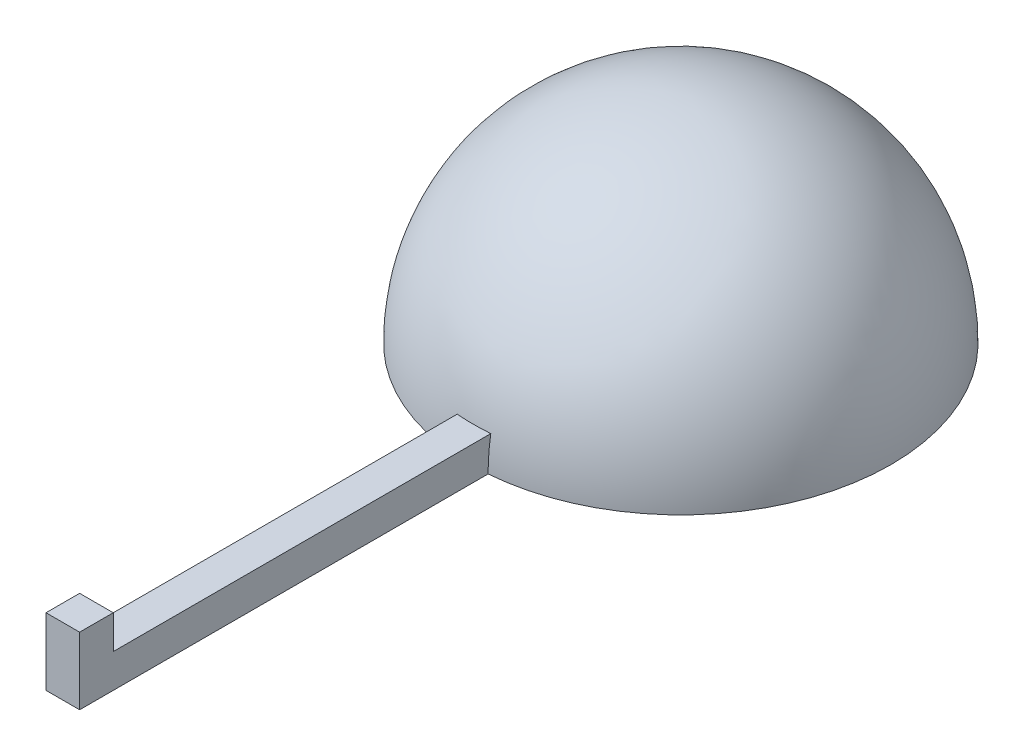
ISO-10303-21;
HEADER;
FILE_DESCRIPTION(('STEP AP214'),'2;1');
FILE_NAME('part.step','',(''),(''),'','','');
FILE_SCHEMA(('AUTOMOTIVE_DESIGN { 1 0 10303 214 1 1 1 1 }'));
ENDSEC;
DATA;
#1=APPLICATION_CONTEXT('core data for automotive mechanical design processes');
#2=APPLICATION_PROTOCOL_DEFINITION('international standard','automotive_design',2000,#1);
#3=PRODUCT_CONTEXT('',#1,'mechanical');
#4=PRODUCT('Part','Part','',(#3));
#5=PRODUCT_RELATED_PRODUCT_CATEGORY('part','',(#4));
#6=PRODUCT_DEFINITION_FORMATION('','',#4);
#7=PRODUCT_DEFINITION_CONTEXT('part definition',#1,'design');
#8=PRODUCT_DEFINITION('design','',#6,#7);
#9=PRODUCT_DEFINITION_SHAPE('','',#8);
#10=(LENGTH_UNIT() NAMED_UNIT(*) SI_UNIT(.MILLI.,.METRE.));
#11=(NAMED_UNIT(*) PLANE_ANGLE_UNIT() SI_UNIT($,.RADIAN.));
#12=(NAMED_UNIT(*) SI_UNIT($,.STERADIAN.) SOLID_ANGLE_UNIT());
#13=UNCERTAINTY_MEASURE_WITH_UNIT(LENGTH_MEASURE(1.E-05),#10,'distance_accuracy_value','');
#14=(GEOMETRIC_REPRESENTATION_CONTEXT(3) GLOBAL_UNCERTAINTY_ASSIGNED_CONTEXT((#13)) GLOBAL_UNIT_ASSIGNED_CONTEXT((#10,
#11,#12)) REPRESENTATION_CONTEXT('',''));
#15=CARTESIAN_POINT('',(0.,0.,0.));
#16=DIRECTION('',(0.,0.,1.));
#17=DIRECTION('',(1.,0.,0.));
#18=AXIS2_PLACEMENT_3D('',#15,#16,#17);
#19=CARTESIAN_POINT('',(0.,0.,0.));
#20=DIRECTION('',(-1.,0.,0.));
#21=DIRECTION('',(0.,0.,1.));
#22=AXIS2_PLACEMENT_3D('',#19,#20,#21);
#23=SPHERICAL_SURFACE('',#22,50.);
#24=CARTESIAN_POINT('',(0.,7.99999999999968,0.));
#25=DIRECTION('',(0.,-1.,0.));
#26=DIRECTION('',(0.,0.,-1.));
#27=AXIS2_PLACEMENT_3D('',#24,#25,#26);
#28=CIRCLE('',#27,49.3558507170123);
#29=CARTESIAN_POINT('',(4.,7.99999999999967,49.1934955049954));
#30=VERTEX_POINT('',#29);
#31=CARTESIAN_POINT('',(-4.,7.99999999999967,49.1934955049954));
#32=VERTEX_POINT('',#31);
#33=EDGE_CURVE('E11',#30,#32,#28,.T.);
#34=ORIENTED_EDGE('',*,*,#33,.F.);
#35=CARTESIAN_POINT('',(4.,0.,0.));
#36=DIRECTION('',(1.,0.,0.));
#37=DIRECTION('',(0.,0.,-1.));
#38=AXIS2_PLACEMENT_3D('',#35,#36,#37);
#39=CIRCLE('',#38,49.8397431775085);
#40=CARTESIAN_POINT('',(4.,-3.4802906647401E-13,49.8397431775085));
#41=VERTEX_POINT('',#40);
#42=EDGE_CURVE('E95',#30,#41,#39,.T.);
#43=ORIENTED_EDGE('',*,*,#42,.T.);
#44=CARTESIAN_POINT('',(0.,0.,0.));
#45=DIRECTION('',(0.,-1.,0.));
#46=DIRECTION('',(0.,0.,1.));
#47=AXIS2_PLACEMENT_3D('',#44,#45,#46);
#48=CIRCLE('',#47,50.);
#49=CARTESIAN_POINT('',(-4.,-3.18879230158559E-13,49.8397431775084));
#50=VERTEX_POINT('',#49);
#51=EDGE_CURVE('E48',#50,#41,#48,.T.);
#52=ORIENTED_EDGE('',*,*,#51,.F.);
#53=CARTESIAN_POINT('',(-4.,0.,0.));
#54=DIRECTION('',(1.,0.,0.));
#55=DIRECTION('',(0.,0.,-1.));
#56=AXIS2_PLACEMENT_3D('',#53,#54,#55);
#57=CIRCLE('',#56,49.8397431775085);
#58=EDGE_CURVE('E58',#32,#50,#57,.T.);
#59=ORIENTED_EDGE('',*,*,#58,.F.);
#60=EDGE_LOOP('',(#34,#43,#52,#59));
#61=FACE_BOUND('',#60,.T.);
#62=ADVANCED_FACE('F41',(#61),#23,.T.);
#63=CARTESIAN_POINT('',(0.,0.,0.));
#64=DIRECTION('',(0.,1.,0.));
#65=DIRECTION('',(0.,0.,1.));
#66=AXIS2_PLACEMENT_3D('',#63,#64,#65);
#67=PLANE('',#66);
#68=CARTESIAN_POINT('',(0.,0.,0.));
#69=DIRECTION('',(0.,1.,0.));
#70=DIRECTION('',(0.,0.,1.));
#71=AXIS2_PLACEMENT_3D('',#68,#69,#70);
#72=CIRCLE('',#71,47.);
#73=CARTESIAN_POINT('',(0.,-3.28199245851255E-13,47.));
#74=VERTEX_POINT('',#73);
#75=EDGE_CURVE('E137',#74,#74,#72,.F.);
#76=ORIENTED_EDGE('',*,*,#75,.F.);
#77=EDGE_LOOP('',(#76));
#78=FACE_BOUND('',#77,.T.);
#79=ORIENTED_EDGE('',*,*,#51,.T.);
#80=DIRECTION('',(0.,0.,-1.));
#81=VECTOR('',#80,1.);
#82=CARTESIAN_POINT('',(4.,0.,147.));
#83=LINE('',#82,#81);
#84=CARTESIAN_POINT('',(4.,0.,147.));
#85=VERTEX_POINT('',#84);
#86=EDGE_CURVE('E97',#85,#41,#83,.T.);
#87=ORIENTED_EDGE('',*,*,#86,.F.);
#88=DIRECTION('',(-1.,0.,0.));
#89=VECTOR('',#88,1.);
#90=CARTESIAN_POINT('',(4.,0.,147.));
#91=LINE('',#90,#89);
#92=CARTESIAN_POINT('',(-4.,0.,147.));
#93=VERTEX_POINT('',#92);
#94=EDGE_CURVE('E118',#85,#93,#91,.T.);
#95=ORIENTED_EDGE('',*,*,#94,.T.);
#96=DIRECTION('',(0.,0.,-1.));
#97=VECTOR('',#96,1.);
#98=CARTESIAN_POINT('',(-4.,0.,147.));
#99=LINE('',#98,#97);
#100=EDGE_CURVE('E119',#93,#50,#99,.T.);
#101=ORIENTED_EDGE('',*,*,#100,.T.);
#102=EDGE_LOOP('',(#79,#87,#95,#101));
#103=FACE_BOUND('',#102,.T.);
#104=ADVANCED_FACE('F142',(#78,#103),#67,.F.);
#105=CARTESIAN_POINT('',(0.,0.,0.));
#106=DIRECTION('',(-1.,0.,0.));
#107=DIRECTION('',(0.,0.,1.));
#108=AXIS2_PLACEMENT_3D('',#105,#106,#107);
#109=SPHERICAL_SURFACE('',#108,47.);
#110=CARTESIAN_POINT('',(0.,0.,0.));
#111=DIRECTION('',(0.,1.,0.));
#112=DIRECTION('',(0.,0.,1.));
#113=AXIS2_PLACEMENT_3D('',#110,#111,#112);
#114=SPHERICAL_SURFACE('',#113,47.);
#115=ORIENTED_EDGE('',*,*,#75,.T.);
#116=EDGE_LOOP('',(#115));
#117=FACE_BOUND('',#116,.T.);
#118=ADVANCED_FACE('F167',(#117),#114,.F.);
#119=CARTESIAN_POINT('',(4.,0.,0.));
#120=DIRECTION('',(1.,0.,0.));
#121=DIRECTION('',(0.,0.,-1.));
#122=AXIS2_PLACEMENT_3D('',#119,#120,#121);
#123=PLANE('',#122);
#124=ORIENTED_EDGE('',*,*,#42,.F.);
#125=DIRECTION('',(0.,0.,1.));
#126=VECTOR('',#125,1.);
#127=CARTESIAN_POINT('',(4.,7.99999999999967,47.));
#128=LINE('',#127,#126);
#129=CARTESIAN_POINT('',(4.,7.99999999999966,139.));
#130=VERTEX_POINT('',#129);
#131=EDGE_CURVE('E88',#30,#130,#128,.T.);
#132=ORIENTED_EDGE('',*,*,#131,.T.);
#133=DIRECTION('',(0.,1.,0.));
#134=VECTOR('',#133,1.);
#135=CARTESIAN_POINT('',(4.,7.99999999999966,139.));
#136=LINE('',#135,#134);
#137=CARTESIAN_POINT('',(4.,15.9999999999997,139.));
#138=VERTEX_POINT('',#137);
#139=EDGE_CURVE('E92',#130,#138,#136,.T.);
#140=ORIENTED_EDGE('',*,*,#139,.T.);
#141=DIRECTION('',(0.,0.,1.));
#142=VECTOR('',#141,1.);
#143=CARTESIAN_POINT('',(4.,15.9999999999997,139.));
#144=LINE('',#143,#142);
#145=CARTESIAN_POINT('',(4.,15.9999999999997,147.));
#146=VERTEX_POINT('',#145);
#147=EDGE_CURVE('E111',#138,#146,#144,.T.);
#148=ORIENTED_EDGE('',*,*,#147,.T.);
#149=DIRECTION('',(0.,-1.,0.));
#150=VECTOR('',#149,1.);
#151=CARTESIAN_POINT('',(4.,15.9999999999997,147.));
#152=LINE('',#151,#150);
#153=EDGE_CURVE('E113',#146,#85,#152,.T.);
#154=ORIENTED_EDGE('',*,*,#153,.T.);
#155=ORIENTED_EDGE('',*,*,#86,.T.);
#156=EDGE_LOOP('',(#124,#132,#140,#148,#154,#155));
#157=FACE_BOUND('',#156,.T.);
#158=ADVANCED_FACE('F90',(#157),#123,.T.);
#159=CARTESIAN_POINT('',(-4.,0.,0.));
#160=DIRECTION('',(1.,0.,0.));
#161=DIRECTION('',(0.,0.,-1.));
#162=AXIS2_PLACEMENT_3D('',#159,#160,#161);
#163=PLANE('',#162);
#164=DIRECTION('',(0.,0.,1.));
#165=VECTOR('',#164,1.);
#166=CARTESIAN_POINT('',(-4.,7.99999999999967,47.));
#167=LINE('',#166,#165);
#168=CARTESIAN_POINT('',(-4.,7.99999999999966,139.));
#169=VERTEX_POINT('',#168);
#170=EDGE_CURVE('E103',#32,#169,#167,.T.);
#171=ORIENTED_EDGE('',*,*,#170,.F.);
#172=ORIENTED_EDGE('',*,*,#58,.T.);
#173=ORIENTED_EDGE('',*,*,#100,.F.);
#174=DIRECTION('',(0.,-1.,0.));
#175=VECTOR('',#174,1.);
#176=CARTESIAN_POINT('',(-4.,15.9999999999997,147.));
#177=LINE('',#176,#175);
#178=CARTESIAN_POINT('',(-4.,15.9999999999997,147.));
#179=VERTEX_POINT('',#178);
#180=EDGE_CURVE('E127',#179,#93,#177,.T.);
#181=ORIENTED_EDGE('',*,*,#180,.F.);
#182=DIRECTION('',(0.,0.,1.));
#183=VECTOR('',#182,1.);
#184=CARTESIAN_POINT('',(-4.,15.9999999999997,139.));
#185=LINE('',#184,#183);
#186=CARTESIAN_POINT('',(-4.,15.9999999999997,139.));
#187=VERTEX_POINT('',#186);
#188=EDGE_CURVE('E125',#187,#179,#185,.T.);
#189=ORIENTED_EDGE('',*,*,#188,.F.);
#190=DIRECTION('',(0.,1.,0.));
#191=VECTOR('',#190,1.);
#192=CARTESIAN_POINT('',(-4.,7.99999999999966,139.));
#193=LINE('',#192,#191);
#194=EDGE_CURVE('E123',#169,#187,#193,.T.);
#195=ORIENTED_EDGE('',*,*,#194,.F.);
#196=EDGE_LOOP('',(#171,#172,#173,#181,#189,#195));
#197=FACE_BOUND('',#196,.T.);
#198=ADVANCED_FACE('F151',(#197),#163,.F.);
#199=CARTESIAN_POINT('',(4.,7.99999999999967,47.));
#200=DIRECTION('',(0.,-1.,0.));
#201=DIRECTION('',(0.,0.,-1.));
#202=AXIS2_PLACEMENT_3D('',#199,#200,#201);
#203=PLANE('',#202);
#204=ORIENTED_EDGE('',*,*,#131,.F.);
#205=ORIENTED_EDGE('',*,*,#33,.T.);
#206=ORIENTED_EDGE('',*,*,#170,.T.);
#207=DIRECTION('',(-1.,0.,0.));
#208=VECTOR('',#207,1.);
#209=CARTESIAN_POINT('',(4.,7.99999999999966,139.));
#210=LINE('',#209,#208);
#211=EDGE_CURVE('E100',#130,#169,#210,.T.);
#212=ORIENTED_EDGE('',*,*,#211,.F.);
#213=EDGE_LOOP('',(#204,#205,#206,#212));
#214=FACE_BOUND('',#213,.T.);
#215=ADVANCED_FACE('F101',(#214),#203,.F.);
#216=CARTESIAN_POINT('',(4.,7.99999999999966,139.));
#217=DIRECTION('',(0.,0.,1.));
#218=DIRECTION('',(1.,0.,0.));
#219=AXIS2_PLACEMENT_3D('',#216,#217,#218);
#220=PLANE('',#219);
#221=ORIENTED_EDGE('',*,*,#194,.T.);
#222=DIRECTION('',(-1.,0.,0.));
#223=VECTOR('',#222,1.);
#224=CARTESIAN_POINT('',(4.,15.9999999999997,139.));
#225=LINE('',#224,#223);
#226=EDGE_CURVE('E106',#138,#187,#225,.T.);
#227=ORIENTED_EDGE('',*,*,#226,.F.);
#228=ORIENTED_EDGE('',*,*,#139,.F.);
#229=ORIENTED_EDGE('',*,*,#211,.T.);
#230=EDGE_LOOP('',(#221,#227,#228,#229));
#231=FACE_BOUND('',#230,.T.);
#232=ADVANCED_FACE('F108',(#231),#220,.F.);
#233=CARTESIAN_POINT('',(4.,15.9999999999997,139.));
#234=DIRECTION('',(0.,-1.,0.));
#235=DIRECTION('',(0.,0.,-1.));
#236=AXIS2_PLACEMENT_3D('',#233,#234,#235);
#237=PLANE('',#236);
#238=ORIENTED_EDGE('',*,*,#188,.T.);
#239=DIRECTION('',(-1.,0.,0.));
#240=VECTOR('',#239,1.);
#241=CARTESIAN_POINT('',(4.,15.9999999999997,147.));
#242=LINE('',#241,#240);
#243=EDGE_CURVE('E131',#146,#179,#242,.T.);
#244=ORIENTED_EDGE('',*,*,#243,.F.);
#245=ORIENTED_EDGE('',*,*,#147,.F.);
#246=ORIENTED_EDGE('',*,*,#226,.T.);
#247=EDGE_LOOP('',(#238,#244,#245,#246));
#248=FACE_BOUND('',#247,.T.);
#249=ADVANCED_FACE('F154',(#248),#237,.F.);
#250=CARTESIAN_POINT('',(4.,15.9999999999997,147.));
#251=DIRECTION('',(0.,0.,-1.));
#252=DIRECTION('',(-1.,0.,0.));
#253=AXIS2_PLACEMENT_3D('',#250,#251,#252);
#254=PLANE('',#253);
#255=ORIENTED_EDGE('',*,*,#180,.T.);
#256=ORIENTED_EDGE('',*,*,#94,.F.);
#257=ORIENTED_EDGE('',*,*,#153,.F.);
#258=ORIENTED_EDGE('',*,*,#243,.T.);
#259=EDGE_LOOP('',(#255,#256,#257,#258));
#260=FACE_BOUND('',#259,.T.);
#261=ADVANCED_FACE('F148',(#260),#254,.F.);
#262=CLOSED_SHELL('',(#62,#104,#118,#158,#198,#215,#232,#249,#261));
#263=MANIFOLD_SOLID_BREP('B2',#262);
#264=ADVANCED_BREP_SHAPE_REPRESENTATION('',(#18,#263),#14);
#265=SHAPE_DEFINITION_REPRESENTATION(#9,#264);
ENDSEC;
END-ISO-10303-21;
